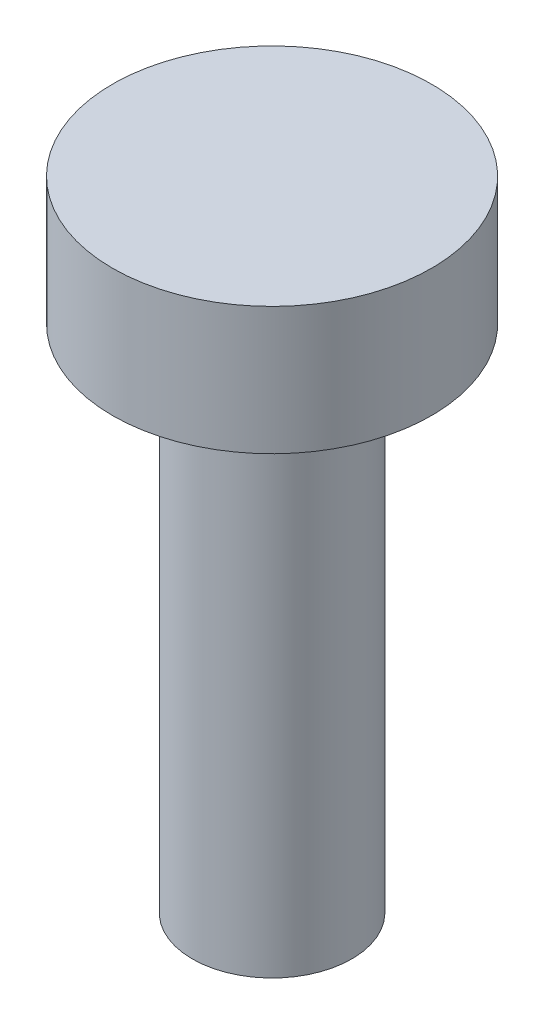
ISO-10303-21;
HEADER;
FILE_DESCRIPTION(('STEP AP214'),'2;1');
FILE_NAME('part.step','',(''),(''),'','','');
FILE_SCHEMA(('AUTOMOTIVE_DESIGN { 1 0 10303 214 1 1 1 1 }'));
ENDSEC;
DATA;
#1=APPLICATION_CONTEXT('core data for automotive mechanical design processes');
#2=APPLICATION_PROTOCOL_DEFINITION('international standard','automotive_design',2000,#1);
#3=PRODUCT_CONTEXT('',#1,'mechanical');
#4=PRODUCT('Part','Part','',(#3));
#5=PRODUCT_RELATED_PRODUCT_CATEGORY('part','',(#4));
#6=PRODUCT_DEFINITION_FORMATION('','',#4);
#7=PRODUCT_DEFINITION_CONTEXT('part definition',#1,'design');
#8=PRODUCT_DEFINITION('design','',#6,#7);
#9=PRODUCT_DEFINITION_SHAPE('','',#8);
#10=(LENGTH_UNIT() NAMED_UNIT(*) SI_UNIT(.MILLI.,.METRE.));
#11=(NAMED_UNIT(*) PLANE_ANGLE_UNIT() SI_UNIT($,.RADIAN.));
#12=(NAMED_UNIT(*) SI_UNIT($,.STERADIAN.) SOLID_ANGLE_UNIT());
#13=UNCERTAINTY_MEASURE_WITH_UNIT(LENGTH_MEASURE(1.E-05),#10,'distance_accuracy_value','');
#14=(GEOMETRIC_REPRESENTATION_CONTEXT(3) GLOBAL_UNCERTAINTY_ASSIGNED_CONTEXT((#13)) GLOBAL_UNIT_ASSIGNED_CONTEXT((#10,
#11,#12)) REPRESENTATION_CONTEXT('',''));
#15=CARTESIAN_POINT('',(0.,0.,0.));
#16=DIRECTION('',(0.,0.,1.));
#17=DIRECTION('',(1.,0.,0.));
#18=AXIS2_PLACEMENT_3D('',#15,#16,#17);
#19=CARTESIAN_POINT('',(0.,0.,0.));
#20=DIRECTION('',(0.,1.,0.));
#21=DIRECTION('',(0.,0.,1.));
#22=AXIS2_PLACEMENT_3D('',#19,#20,#21);
#23=PLANE('',#22);
#24=CARTESIAN_POINT('',(0.,0.,0.));
#25=DIRECTION('',(0.,1.,0.));
#26=DIRECTION('',(0.,0.,1.));
#27=AXIS2_PLACEMENT_3D('',#24,#25,#26);
#28=CIRCLE('',#27,1.25);
#29=CARTESIAN_POINT('',(0.,0.,1.25));
#30=VERTEX_POINT('',#29);
#31=EDGE_CURVE('E10',#30,#30,#28,.T.);
#32=ORIENTED_EDGE('',*,*,#31,.F.);
#33=EDGE_LOOP('',(#32));
#34=FACE_BOUND('',#33,.T.);
#35=ADVANCED_FACE('F30',(#34),#23,.F.);
#36=CARTESIAN_POINT('',(0.,9.99999999999999,0.));
#37=DIRECTION('',(0.,1.,0.));
#38=DIRECTION('',(0.,0.,1.));
#39=AXIS2_PLACEMENT_3D('',#36,#37,#38);
#40=CYLINDRICAL_SURFACE('',#39,1.25);
#41=CARTESIAN_POINT('',(0.,8.,0.));
#42=DIRECTION('',(0.,1.,0.));
#43=DIRECTION('',(0.,0.,1.));
#44=AXIS2_PLACEMENT_3D('',#41,#42,#43);
#45=CIRCLE('',#44,1.25);
#46=CARTESIAN_POINT('',(0.,8.,1.25));
#47=VERTEX_POINT('',#46);
#48=EDGE_CURVE('E36',#47,#47,#45,.T.);
#49=ORIENTED_EDGE('',*,*,#48,.F.);
#50=EDGE_LOOP('',(#49));
#51=FACE_BOUND('',#50,.T.);
#52=ORIENTED_EDGE('',*,*,#31,.T.);
#53=EDGE_LOOP('',(#52));
#54=FACE_BOUND('',#53,.T.);
#55=ADVANCED_FACE('F60',(#51,#54),#40,.T.);
#56=CARTESIAN_POINT('',(1.25,8.,0.));
#57=DIRECTION('',(0.,1.,0.));
#58=DIRECTION('',(0.,0.,1.));
#59=AXIS2_PLACEMENT_3D('',#56,#57,#58);
#60=PLANE('',#59);
#61=CARTESIAN_POINT('',(0.,8.,0.));
#62=DIRECTION('',(0.,1.,0.));
#63=DIRECTION('',(0.,0.,1.));
#64=AXIS2_PLACEMENT_3D('',#61,#62,#63);
#65=CIRCLE('',#64,2.5);
#66=CARTESIAN_POINT('',(0.,8.,2.5));
#67=VERTEX_POINT('',#66);
#68=EDGE_CURVE('E40',#67,#67,#65,.T.);
#69=ORIENTED_EDGE('',*,*,#68,.F.);
#70=EDGE_LOOP('',(#69));
#71=FACE_BOUND('',#70,.T.);
#72=ORIENTED_EDGE('',*,*,#48,.T.);
#73=EDGE_LOOP('',(#72));
#74=FACE_BOUND('',#73,.T.);
#75=ADVANCED_FACE('F55',(#71,#74),#60,.F.);
#76=CARTESIAN_POINT('',(0.,9.99999999999999,0.));
#77=DIRECTION('',(0.,1.,0.));
#78=DIRECTION('',(0.,0.,1.));
#79=AXIS2_PLACEMENT_3D('',#76,#77,#78);
#80=CYLINDRICAL_SURFACE('',#79,2.5);
#81=CARTESIAN_POINT('',(0.,10.,0.));
#82=DIRECTION('',(0.,1.,0.));
#83=DIRECTION('',(0.,0.,1.));
#84=AXIS2_PLACEMENT_3D('',#81,#82,#83);
#85=CIRCLE('',#84,2.5);
#86=CARTESIAN_POINT('',(0.,10.,2.5));
#87=VERTEX_POINT('',#86);
#88=EDGE_CURVE('E44',#87,#87,#85,.T.);
#89=ORIENTED_EDGE('',*,*,#88,.F.);
#90=EDGE_LOOP('',(#89));
#91=FACE_BOUND('',#90,.T.);
#92=ORIENTED_EDGE('',*,*,#68,.T.);
#93=EDGE_LOOP('',(#92));
#94=FACE_BOUND('',#93,.T.);
#95=ADVANCED_FACE('F52',(#91,#94),#80,.T.);
#96=CARTESIAN_POINT('',(2.5,10.,0.));
#97=DIRECTION('',(0.,-1.,0.));
#98=DIRECTION('',(0.,0.,-1.));
#99=AXIS2_PLACEMENT_3D('',#96,#97,#98);
#100=PLANE('',#99);
#101=ORIENTED_EDGE('',*,*,#88,.T.);
#102=EDGE_LOOP('',(#101));
#103=FACE_BOUND('',#102,.T.);
#104=ADVANCED_FACE('F50',(#103),#100,.F.);
#105=CLOSED_SHELL('',(#35,#55,#75,#95,#104));
#106=MANIFOLD_SOLID_BREP('B2',#105);
#107=ADVANCED_BREP_SHAPE_REPRESENTATION('',(#18,#106),#14);
#108=SHAPE_DEFINITION_REPRESENTATION(#9,#107);
ENDSEC;
END-ISO-10303-21;
